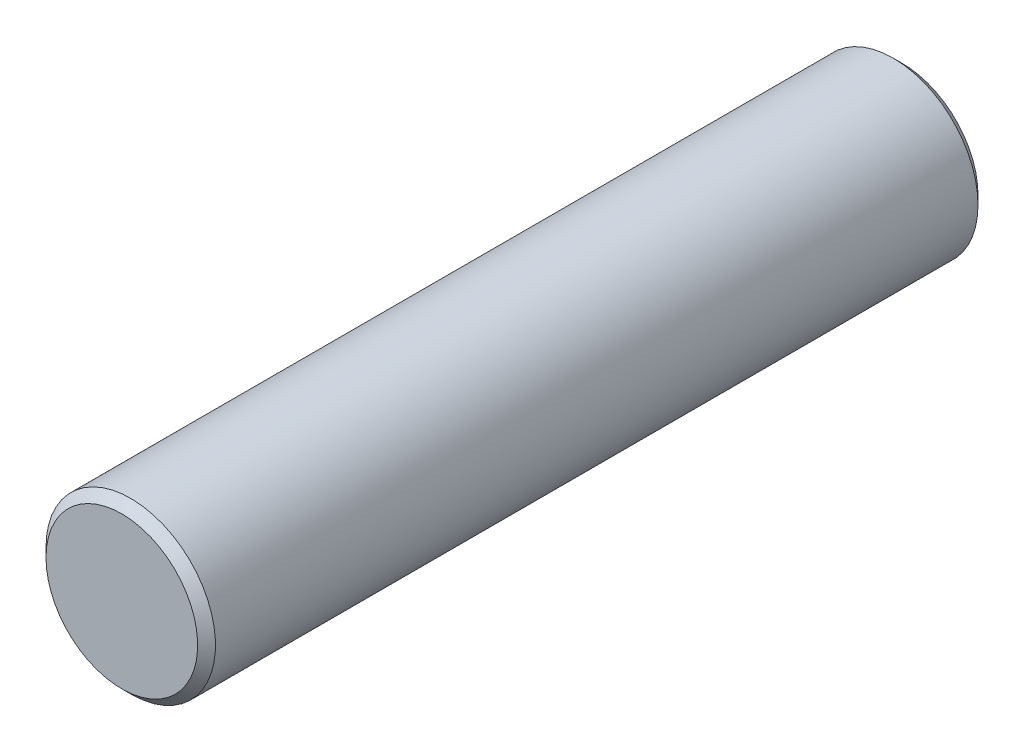
ISO-10303-21;
HEADER;
FILE_DESCRIPTION(('STEP AP214'),'2;1');
FILE_NAME('part.step','',(''),(''),'','','');
FILE_SCHEMA(('AUTOMOTIVE_DESIGN { 1 0 10303 214 1 1 1 1 }'));
ENDSEC;
DATA;
#1=APPLICATION_CONTEXT('core data for automotive mechanical design processes');
#2=APPLICATION_PROTOCOL_DEFINITION('international standard','automotive_design',2000,#1);
#3=PRODUCT_CONTEXT('',#1,'mechanical');
#4=PRODUCT('Part','Part','',(#3));
#5=PRODUCT_RELATED_PRODUCT_CATEGORY('part','',(#4));
#6=PRODUCT_DEFINITION_FORMATION('','',#4);
#7=PRODUCT_DEFINITION_CONTEXT('part definition',#1,'design');
#8=PRODUCT_DEFINITION('design','',#6,#7);
#9=PRODUCT_DEFINITION_SHAPE('','',#8);
#10=(LENGTH_UNIT() NAMED_UNIT(*) SI_UNIT(.MILLI.,.METRE.));
#11=(NAMED_UNIT(*) PLANE_ANGLE_UNIT() SI_UNIT($,.RADIAN.));
#12=(NAMED_UNIT(*) SI_UNIT($,.STERADIAN.) SOLID_ANGLE_UNIT());
#13=UNCERTAINTY_MEASURE_WITH_UNIT(LENGTH_MEASURE(1.E-05),#10,'distance_accuracy_value','');
#14=(GEOMETRIC_REPRESENTATION_CONTEXT(3) GLOBAL_UNCERTAINTY_ASSIGNED_CONTEXT((#13)) GLOBAL_UNIT_ASSIGNED_CONTEXT((#10,
#11,#12)) REPRESENTATION_CONTEXT('',''));
#15=CARTESIAN_POINT('',(0.,0.,0.));
#16=DIRECTION('',(0.,0.,1.));
#17=DIRECTION('',(1.,0.,0.));
#18=AXIS2_PLACEMENT_3D('',#15,#16,#17);
#19=CARTESIAN_POINT('',(0.,0.,22.225));
#20=DIRECTION('',(0.,0.,1.));
#21=DIRECTION('',(1.,0.,0.));
#22=AXIS2_PLACEMENT_3D('',#19,#20,#21);
#23=PLANE('',#22);
#24=CARTESIAN_POINT('',(0.,0.,22.2249999999917));
#25=DIRECTION('',(0.,0.,-1.));
#26=DIRECTION('',(-1.,0.,0.));
#27=AXIS2_PLACEMENT_3D('',#24,#25,#26);
#28=CIRCLE('',#27,2.15900000006286);
#29=CARTESIAN_POINT('',(-2.15900000006286,0.,22.2249999999917));
#30=VERTEX_POINT('',#29);
#31=EDGE_CURVE('E18',#30,#30,#28,.T.);
#32=ORIENTED_EDGE('',*,*,#31,.F.);
#33=EDGE_LOOP('',(#32));
#34=FACE_BOUND('',#33,.T.);
#35=ADVANCED_FACE('F15',(#34),#23,.T.);
#36=CARTESIAN_POINT('',(0.,0.,0.));
#37=DIRECTION('',(0.,0.,1.));
#38=DIRECTION('',(1.,0.,0.));
#39=AXIS2_PLACEMENT_3D('',#36,#37,#38);
#40=PLANE('',#39);
#41=CARTESIAN_POINT('',(0.,0.,0.));
#42=DIRECTION('',(0.,0.,1.));
#43=DIRECTION('',(1.,0.,0.));
#44=AXIS2_PLACEMENT_3D('',#41,#42,#43);
#45=CIRCLE('',#44,2.15900000006286);
#46=CARTESIAN_POINT('',(2.15900000006286,0.,0.));
#47=VERTEX_POINT('',#46);
#48=EDGE_CURVE('E27',#47,#47,#45,.T.);
#49=ORIENTED_EDGE('',*,*,#48,.F.);
#50=EDGE_LOOP('',(#49));
#51=FACE_BOUND('',#50,.T.);
#52=ADVANCED_FACE('F38',(#51),#40,.F.);
#53=CARTESIAN_POINT('',(0.,0.,21.9710000000077));
#54=DIRECTION('',(0.,0.,-1.));
#55=DIRECTION('',(-1.,0.,0.));
#56=AXIS2_PLACEMENT_3D('',#53,#54,#55);
#57=CONICAL_SURFACE('',#56,2.41300000004685,0.785398163397448);
#58=CARTESIAN_POINT('',(0.,0.,21.971));
#59=DIRECTION('',(0.,0.,-1.));
#60=DIRECTION('',(-1.,0.,0.));
#61=AXIS2_PLACEMENT_3D('',#58,#59,#60);
#62=CIRCLE('',#61,2.413);
#63=CARTESIAN_POINT('',(-2.413,0.,21.971));
#64=VERTEX_POINT('',#63);
#65=EDGE_CURVE('E22',#64,#64,#62,.T.);
#66=ORIENTED_EDGE('',*,*,#65,.F.);
#67=EDGE_LOOP('',(#66));
#68=FACE_BOUND('',#67,.T.);
#69=ORIENTED_EDGE('',*,*,#31,.T.);
#70=EDGE_LOOP('',(#69));
#71=FACE_BOUND('',#70,.T.);
#72=ADVANCED_FACE('F35',(#68,#71),#57,.T.);
#73=CARTESIAN_POINT('',(0.,0.,0.253999999927146));
#74=DIRECTION('',(0.,0.,1.));
#75=DIRECTION('',(1.,0.,0.));
#76=AXIS2_PLACEMENT_3D('',#73,#74,#75);
#77=CONICAL_SURFACE('',#76,2.41299999993316,0.785398163285552);
#78=CARTESIAN_POINT('',(0.,0.,0.253999999999997));
#79=DIRECTION('',(0.,0.,-1.));
#80=DIRECTION('',(-1.,0.,0.));
#81=AXIS2_PLACEMENT_3D('',#78,#79,#80);
#82=CIRCLE('',#81,2.413);
#83=CARTESIAN_POINT('',(-2.413,0.,0.253999999999997));
#84=VERTEX_POINT('',#83);
#85=EDGE_CURVE('E10',#84,#84,#82,.F.);
#86=ORIENTED_EDGE('',*,*,#85,.F.);
#87=EDGE_LOOP('',(#86));
#88=FACE_BOUND('',#87,.T.);
#89=ORIENTED_EDGE('',*,*,#48,.T.);
#90=EDGE_LOOP('',(#89));
#91=FACE_BOUND('',#90,.T.);
#92=ADVANCED_FACE('F46',(#88,#91),#77,.T.);
#93=CARTESIAN_POINT('',(0.,0.,22.225));
#94=DIRECTION('',(0.,0.,-1.));
#95=DIRECTION('',(-1.,0.,0.));
#96=AXIS2_PLACEMENT_3D('',#93,#94,#95);
#97=CYLINDRICAL_SURFACE('',#96,2.413);
#98=ORIENTED_EDGE('',*,*,#85,.T.);
#99=EDGE_LOOP('',(#98));
#100=FACE_BOUND('',#99,.T.);
#101=ORIENTED_EDGE('',*,*,#65,.T.);
#102=EDGE_LOOP('',(#101));
#103=FACE_BOUND('',#102,.T.);
#104=ADVANCED_FACE('F44',(#100,#103),#97,.T.);
#105=CLOSED_SHELL('',(#35,#52,#72,#92,#104));
#106=MANIFOLD_SOLID_BREP('B1',#105);
#107=ADVANCED_BREP_SHAPE_REPRESENTATION('',(#18,#106),#14);
#108=SHAPE_DEFINITION_REPRESENTATION(#9,#107);
ENDSEC;
END-ISO-10303-21;
